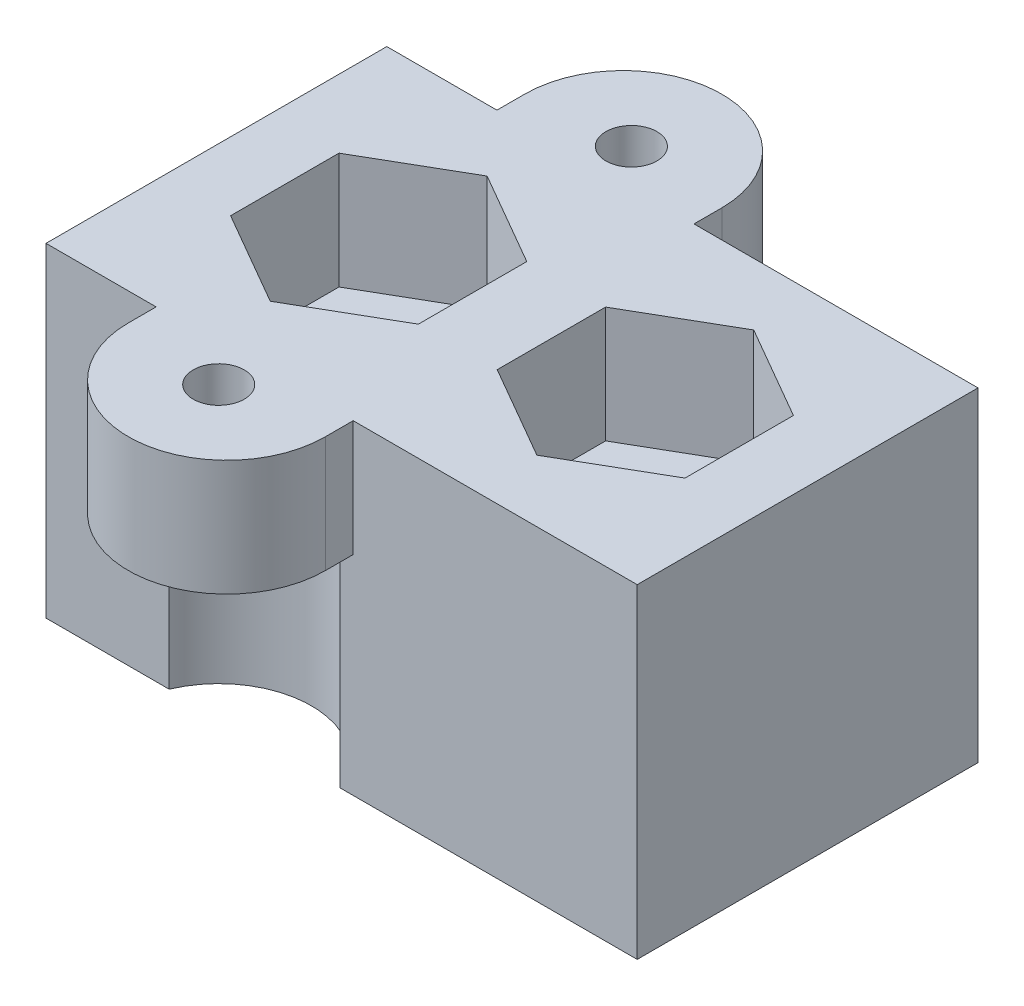
ISO-10303-21;
HEADER;
FILE_DESCRIPTION(('STEP AP214'),'2;1');
FILE_NAME('part.step','',(''),(''),'','','');
FILE_SCHEMA(('AUTOMOTIVE_DESIGN { 1 0 10303 214 1 1 1 1 }'));
ENDSEC;
DATA;
#1=APPLICATION_CONTEXT('core data for automotive mechanical design processes');
#2=APPLICATION_PROTOCOL_DEFINITION('international standard','automotive_design',2000,#1);
#3=PRODUCT_CONTEXT('',#1,'mechanical');
#4=PRODUCT('Part','Part','',(#3));
#5=PRODUCT_RELATED_PRODUCT_CATEGORY('part','',(#4));
#6=PRODUCT_DEFINITION_FORMATION('','',#4);
#7=PRODUCT_DEFINITION_CONTEXT('part definition',#1,'design');
#8=PRODUCT_DEFINITION('design','',#6,#7);
#9=PRODUCT_DEFINITION_SHAPE('','',#8);
#10=(LENGTH_UNIT() NAMED_UNIT(*) SI_UNIT(.MILLI.,.METRE.));
#11=(NAMED_UNIT(*) PLANE_ANGLE_UNIT() SI_UNIT($,.RADIAN.));
#12=(NAMED_UNIT(*) SI_UNIT($,.STERADIAN.) SOLID_ANGLE_UNIT());
#13=UNCERTAINTY_MEASURE_WITH_UNIT(LENGTH_MEASURE(1.E-05),#10,'distance_accuracy_value','');
#14=(GEOMETRIC_REPRESENTATION_CONTEXT(3) GLOBAL_UNCERTAINTY_ASSIGNED_CONTEXT((#13)) GLOBAL_UNIT_ASSIGNED_CONTEXT((#10,
#11,#12)) REPRESENTATION_CONTEXT('',''));
#15=CARTESIAN_POINT('',(0.,0.,0.));
#16=DIRECTION('',(0.,0.,1.));
#17=DIRECTION('',(1.,0.,0.));
#18=AXIS2_PLACEMENT_3D('',#15,#16,#17);
#19=CARTESIAN_POINT('',(11.0405831282105,0.,0.));
#20=DIRECTION('',(0.,-1.,0.));
#21=DIRECTION('',(0.,0.,-1.));
#22=AXIS2_PLACEMENT_3D('',#19,#20,#21);
#23=CYLINDRICAL_SURFACE('',#22,2.65);
#24=CARTESIAN_POINT('',(11.0405831282105,0.,0.));
#25=DIRECTION('',(0.,-1.,0.));
#26=DIRECTION('',(0.,0.,-1.));
#27=AXIS2_PLACEMENT_3D('',#24,#25,#26);
#28=CIRCLE('',#27,2.65);
#29=CARTESIAN_POINT('',(11.0405831282105,0.,-2.65));
#30=VERTEX_POINT('',#29);
#31=EDGE_CURVE('E327',#30,#30,#28,.T.);
#32=ORIENTED_EDGE('',*,*,#31,.T.);
#33=EDGE_LOOP('',(#32));
#34=FACE_BOUND('',#33,.T.);
#35=CARTESIAN_POINT('',(11.0405831282105,9.,0.));
#36=DIRECTION('',(0.,1.,0.));
#37=DIRECTION('',(0.,0.,1.));
#38=AXIS2_PLACEMENT_3D('',#35,#36,#37);
#39=CIRCLE('',#38,2.65);
#40=CARTESIAN_POINT('',(11.0405831282105,9.,2.65));
#41=VERTEX_POINT('',#40);
#42=EDGE_CURVE('E40',#41,#41,#39,.F.);
#43=ORIENTED_EDGE('',*,*,#42,.F.);
#44=EDGE_LOOP('',(#43));
#45=FACE_BOUND('',#44,.T.);
#46=ADVANCED_FACE('F35',(#34,#45),#23,.F.);
#47=CARTESIAN_POINT('',(22.5405831282105,0.,0.));
#48=DIRECTION('',(0.,-1.,0.));
#49=DIRECTION('',(0.,0.,-1.));
#50=AXIS2_PLACEMENT_3D('',#47,#48,#49);
#51=CYLINDRICAL_SURFACE('',#50,2.65);
#52=CARTESIAN_POINT('',(22.5405831282105,0.,0.));
#53=DIRECTION('',(0.,-1.,0.));
#54=DIRECTION('',(0.,0.,-1.));
#55=AXIS2_PLACEMENT_3D('',#52,#53,#54);
#56=CIRCLE('',#55,2.65);
#57=CARTESIAN_POINT('',(22.5405831282105,0.,-2.65));
#58=VERTEX_POINT('',#57);
#59=EDGE_CURVE('E324',#58,#58,#56,.T.);
#60=ORIENTED_EDGE('',*,*,#59,.T.);
#61=EDGE_LOOP('',(#60));
#62=FACE_BOUND('',#61,.T.);
#63=CARTESIAN_POINT('',(22.5405831282105,9.,0.));
#64=DIRECTION('',(0.,1.,0.));
#65=DIRECTION('',(0.,0.,1.));
#66=AXIS2_PLACEMENT_3D('',#63,#64,#65);
#67=CIRCLE('',#66,2.65);
#68=CARTESIAN_POINT('',(22.5405831282105,9.,2.65));
#69=VERTEX_POINT('',#68);
#70=EDGE_CURVE('E271',#69,#69,#67,.F.);
#71=ORIENTED_EDGE('',*,*,#70,.F.);
#72=EDGE_LOOP('',(#71));
#73=FACE_BOUND('',#72,.T.);
#74=ADVANCED_FACE('F462',(#62,#73),#51,.F.);
#75=CARTESIAN_POINT('',(4.04058312821053,14.,7.35));
#76=DIRECTION('',(0.,0.,-1.));
#77=DIRECTION('',(-1.,0.,0.));
#78=AXIS2_PLACEMENT_3D('',#75,#76,#77);
#79=PLANE('',#78);
#80=DIRECTION('',(0.,-1.,0.));
#81=VECTOR('',#80,1.);
#82=CARTESIAN_POINT('',(16.728061941709,20.3137084989848,7.35));
#83=LINE('',#82,#81);
#84=CARTESIAN_POINT('',(16.728061941709,0.,7.35));
#85=VERTEX_POINT('',#84);
#86=CARTESIAN_POINT('',(16.728061941709,9.,7.35));
#87=VERTEX_POINT('',#86);
#88=EDGE_CURVE('E338',#85,#87,#83,.F.);
#89=ORIENTED_EDGE('',*,*,#88,.F.);
#90=DIRECTION('',(1.,0.,0.));
#91=VECTOR('',#90,1.);
#92=CARTESIAN_POINT('',(4.04058312821053,0.,7.35));
#93=LINE('',#92,#91);
#94=CARTESIAN_POINT('',(29.5405831282105,0.,7.35));
#95=VERTEX_POINT('',#94);
#96=EDGE_CURVE('E419',#85,#95,#93,.T.);
#97=ORIENTED_EDGE('',*,*,#96,.T.);
#98=DIRECTION('',(0.,-1.,0.));
#99=VECTOR('',#98,1.);
#100=CARTESIAN_POINT('',(29.5405831282105,14.,7.35));
#101=LINE('',#100,#99);
#102=CARTESIAN_POINT('',(29.5405831282105,14.,7.35));
#103=VERTEX_POINT('',#102);
#104=EDGE_CURVE('E433',#103,#95,#101,.T.);
#105=ORIENTED_EDGE('',*,*,#104,.F.);
#106=DIRECTION('',(1.,0.,0.));
#107=VECTOR('',#106,1.);
#108=CARTESIAN_POINT('',(4.04058312821053,14.,7.35));
#109=LINE('',#108,#107);
#110=CARTESIAN_POINT('',(17.2905831282105,14.,7.35));
#111=VERTEX_POINT('',#110);
#112=EDGE_CURVE('E405',#111,#103,#109,.T.);
#113=ORIENTED_EDGE('',*,*,#112,.F.);
#114=DIRECTION('',(0.,1.,0.));
#115=VECTOR('',#114,1.);
#116=CARTESIAN_POINT('',(17.2905831282105,9.,7.35));
#117=LINE('',#116,#115);
#118=CARTESIAN_POINT('',(17.2905831282105,9.,7.35));
#119=VERTEX_POINT('',#118);
#120=EDGE_CURVE('E357',#119,#111,#117,.T.);
#121=ORIENTED_EDGE('',*,*,#120,.F.);
#122=DIRECTION('',(-1.,0.,0.));
#123=VECTOR('',#122,1.);
#124=CARTESIAN_POINT('',(8.79058312821052,9.,7.35));
#125=LINE('',#124,#123);
#126=EDGE_CURVE('E352',#119,#87,#125,.T.);
#127=ORIENTED_EDGE('',*,*,#126,.T.);
#128=EDGE_LOOP('',(#89,#97,#105,#113,#121,#127));
#129=FACE_BOUND('',#128,.T.);
#130=ADVANCED_FACE('F468',(#129),#79,.F.);
#131=DIRECTION('',(0.,-1.,0.));
#132=VECTOR('',#131,1.);
#133=CARTESIAN_POINT('',(9.35310431471207,20.3137084989848,7.35));
#134=LINE('',#133,#132);
#135=CARTESIAN_POINT('',(9.35310431471207,9.,7.35));
#136=VERTEX_POINT('',#135);
#137=CARTESIAN_POINT('',(9.35310431471207,0.,7.35));
#138=VERTEX_POINT('',#137);
#139=EDGE_CURVE('E336',#136,#138,#134,.T.);
#140=ORIENTED_EDGE('',*,*,#139,.F.);
#141=CARTESIAN_POINT('',(8.79058312821052,9.,7.35));
#142=VERTEX_POINT('',#141);
#143=EDGE_CURVE('E350',#136,#142,#125,.T.);
#144=ORIENTED_EDGE('',*,*,#143,.T.);
#145=DIRECTION('',(0.,1.,0.));
#146=VECTOR('',#145,1.);
#147=CARTESIAN_POINT('',(8.79058312821052,9.,7.35));
#148=LINE('',#147,#146);
#149=CARTESIAN_POINT('',(8.79058312821052,14.,7.35));
#150=VERTEX_POINT('',#149);
#151=EDGE_CURVE('E363',#142,#150,#148,.T.);
#152=ORIENTED_EDGE('',*,*,#151,.T.);
#153=CARTESIAN_POINT('',(4.04058312821053,14.,7.35));
#154=VERTEX_POINT('',#153);
#155=EDGE_CURVE('E407',#154,#150,#109,.T.);
#156=ORIENTED_EDGE('',*,*,#155,.F.);
#157=DIRECTION('',(0.,-1.,0.));
#158=VECTOR('',#157,1.);
#159=CARTESIAN_POINT('',(4.04058312821053,14.,7.35));
#160=LINE('',#159,#158);
#161=CARTESIAN_POINT('',(4.04058312821053,0.,7.35));
#162=VERTEX_POINT('',#161);
#163=EDGE_CURVE('E436',#154,#162,#160,.T.);
#164=ORIENTED_EDGE('',*,*,#163,.T.);
#165=EDGE_CURVE('E420',#162,#138,#93,.T.);
#166=ORIENTED_EDGE('',*,*,#165,.T.);
#167=EDGE_LOOP('',(#140,#144,#152,#156,#164,#166));
#168=FACE_BOUND('',#167,.T.);
#169=ADVANCED_FACE('F535',(#168),#79,.F.);
#170=CARTESIAN_POINT('',(13.0405831282105,9.,8.55));
#171=DIRECTION('',(0.,1.,0.));
#172=DIRECTION('',(0.,0.,1.));
#173=AXIS2_PLACEMENT_3D('',#170,#171,#172);
#174=CYLINDRICAL_SURFACE('',#173,4.25);
#175=DIRECTION('',(0.,1.,0.));
#176=VECTOR('',#175,1.);
#177=CARTESIAN_POINT('',(8.79058312821052,9.,8.55));
#178=LINE('',#177,#176);
#179=CARTESIAN_POINT('',(8.79058312821052,9.,8.55));
#180=VERTEX_POINT('',#179);
#181=CARTESIAN_POINT('',(8.79058312821052,14.,8.55));
#182=VERTEX_POINT('',#181);
#183=EDGE_CURVE('E449',#180,#182,#178,.T.);
#184=ORIENTED_EDGE('',*,*,#183,.F.);
#185=CARTESIAN_POINT('',(13.0405831282105,9.,8.55));
#186=DIRECTION('',(0.,-1.,0.));
#187=DIRECTION('',(0.,0.,-1.));
#188=AXIS2_PLACEMENT_3D('',#185,#186,#187);
#189=CIRCLE('',#188,4.25);
#190=CARTESIAN_POINT('',(17.2905831282105,9.,8.55));
#191=VERTEX_POINT('',#190);
#192=EDGE_CURVE('E45',#191,#180,#189,.T.);
#193=ORIENTED_EDGE('',*,*,#192,.F.);
#194=DIRECTION('',(0.,1.,0.));
#195=VECTOR('',#194,1.);
#196=CARTESIAN_POINT('',(17.2905831282105,9.,8.55));
#197=LINE('',#196,#195);
#198=CARTESIAN_POINT('',(17.2905831282105,14.,8.55));
#199=VERTEX_POINT('',#198);
#200=EDGE_CURVE('E452',#199,#191,#197,.F.);
#201=ORIENTED_EDGE('',*,*,#200,.F.);
#202=CARTESIAN_POINT('',(13.0405831282105,14.,8.55));
#203=DIRECTION('',(0.,-1.,0.));
#204=DIRECTION('',(0.,0.,-1.));
#205=AXIS2_PLACEMENT_3D('',#202,#203,#204);
#206=CIRCLE('',#205,4.25);
#207=EDGE_CURVE('E11',#182,#199,#206,.F.);
#208=ORIENTED_EDGE('',*,*,#207,.F.);
#209=EDGE_LOOP('',(#184,#193,#201,#208));
#210=FACE_BOUND('',#209,.T.);
#211=ADVANCED_FACE('F38',(#210),#174,.T.);
#212=CARTESIAN_POINT('',(4.04058312821053,14.,-7.35));
#213=DIRECTION('',(0.,0.,1.));
#214=DIRECTION('',(1.,0.,0.));
#215=AXIS2_PLACEMENT_3D('',#212,#213,#214);
#216=PLANE('',#215);
#217=DIRECTION('',(-1.,0.,0.));
#218=VECTOR('',#217,1.);
#219=CARTESIAN_POINT('',(8.79058312821052,9.,-7.35));
#220=LINE('',#219,#218);
#221=CARTESIAN_POINT('',(9.35310431471207,9.,-7.35));
#222=VERTEX_POINT('',#221);
#223=CARTESIAN_POINT('',(8.79058312821052,9.,-7.35));
#224=VERTEX_POINT('',#223);
#225=EDGE_CURVE('E389',#222,#224,#220,.T.);
#226=ORIENTED_EDGE('',*,*,#225,.F.);
#227=DIRECTION('',(0.,-1.,0.));
#228=VECTOR('',#227,1.);
#229=CARTESIAN_POINT('',(9.35310431471207,20.3137084989848,-7.35));
#230=LINE('',#229,#228);
#231=CARTESIAN_POINT('',(9.35310431471207,0.,-7.35));
#232=VERTEX_POINT('',#231);
#233=EDGE_CURVE('E373',#222,#232,#230,.T.);
#234=ORIENTED_EDGE('',*,*,#233,.T.);
#235=DIRECTION('',(-1.,0.,0.));
#236=VECTOR('',#235,1.);
#237=CARTESIAN_POINT('',(4.04058312821053,0.,-7.35));
#238=LINE('',#237,#236);
#239=CARTESIAN_POINT('',(4.04058312821053,0.,-7.35));
#240=VERTEX_POINT('',#239);
#241=EDGE_CURVE('E425',#232,#240,#238,.T.);
#242=ORIENTED_EDGE('',*,*,#241,.T.);
#243=DIRECTION('',(0.,-1.,0.));
#244=VECTOR('',#243,1.);
#245=CARTESIAN_POINT('',(4.04058312821053,14.,-7.35));
#246=LINE('',#245,#244);
#247=CARTESIAN_POINT('',(4.04058312821053,14.,-7.35));
#248=VERTEX_POINT('',#247);
#249=EDGE_CURVE('E416',#248,#240,#246,.T.);
#250=ORIENTED_EDGE('',*,*,#249,.F.);
#251=DIRECTION('',(-1.,0.,0.));
#252=VECTOR('',#251,1.);
#253=CARTESIAN_POINT('',(4.04058312821053,14.,-7.35));
#254=LINE('',#253,#252);
#255=CARTESIAN_POINT('',(8.79058312821052,14.,-7.35));
#256=VERTEX_POINT('',#255);
#257=EDGE_CURVE('E412',#256,#248,#254,.T.);
#258=ORIENTED_EDGE('',*,*,#257,.F.);
#259=DIRECTION('',(0.,1.,0.));
#260=VECTOR('',#259,1.);
#261=CARTESIAN_POINT('',(8.79058312821052,9.,-7.35));
#262=LINE('',#261,#260);
#263=EDGE_CURVE('E393',#224,#256,#262,.T.);
#264=ORIENTED_EDGE('',*,*,#263,.F.);
#265=EDGE_LOOP('',(#226,#234,#242,#250,#258,#264));
#266=FACE_BOUND('',#265,.T.);
#267=ADVANCED_FACE('F529',(#266),#216,.F.);
#268=CARTESIAN_POINT('',(13.0405831282105,14.,-8.55));
#269=DIRECTION('',(0.,1.,0.));
#270=DIRECTION('',(0.,0.,1.));
#271=AXIS2_PLACEMENT_3D('',#268,#269,#270);
#272=CYLINDRICAL_SURFACE('',#271,4.25);
#273=DIRECTION('',(0.,1.,0.));
#274=VECTOR('',#273,1.);
#275=CARTESIAN_POINT('',(8.79058312821052,9.,-8.55));
#276=LINE('',#275,#274);
#277=CARTESIAN_POINT('',(8.79058312821052,14.,-8.55));
#278=VERTEX_POINT('',#277);
#279=CARTESIAN_POINT('',(8.79058312821052,9.,-8.55));
#280=VERTEX_POINT('',#279);
#281=EDGE_CURVE('E439',#278,#280,#276,.F.);
#282=ORIENTED_EDGE('',*,*,#281,.F.);
#283=CARTESIAN_POINT('',(13.0405831282105,14.,-8.55));
#284=DIRECTION('',(0.,-1.,0.));
#285=DIRECTION('',(0.,0.,-1.));
#286=AXIS2_PLACEMENT_3D('',#283,#284,#285);
#287=CIRCLE('',#286,4.25);
#288=CARTESIAN_POINT('',(17.2905831282105,14.,-8.55));
#289=VERTEX_POINT('',#288);
#290=EDGE_CURVE('E445',#289,#278,#287,.F.);
#291=ORIENTED_EDGE('',*,*,#290,.F.);
#292=DIRECTION('',(0.,1.,0.));
#293=VECTOR('',#292,1.);
#294=CARTESIAN_POINT('',(17.2905831282105,9.,-8.55));
#295=LINE('',#294,#293);
#296=CARTESIAN_POINT('',(17.2905831282105,9.,-8.55));
#297=VERTEX_POINT('',#296);
#298=EDGE_CURVE('E442',#297,#289,#295,.T.);
#299=ORIENTED_EDGE('',*,*,#298,.F.);
#300=CARTESIAN_POINT('',(13.0405831282105,9.,-8.55));
#301=DIRECTION('',(0.,-1.,0.));
#302=DIRECTION('',(0.,0.,-1.));
#303=AXIS2_PLACEMENT_3D('',#300,#301,#302);
#304=CIRCLE('',#303,4.25);
#305=EDGE_CURVE('E447',#280,#297,#304,.T.);
#306=ORIENTED_EDGE('',*,*,#305,.F.);
#307=EDGE_LOOP('',(#282,#291,#299,#306));
#308=FACE_BOUND('',#307,.T.);
#309=ADVANCED_FACE('F527',(#308),#272,.T.);
#310=CARTESIAN_POINT('',(29.5405831282105,0.,-7.35));
#311=VERTEX_POINT('',#310);
#312=CARTESIAN_POINT('',(16.728061941709,0.,-7.35));
#313=VERTEX_POINT('',#312);
#314=EDGE_CURVE('E406',#311,#313,#238,.T.);
#315=ORIENTED_EDGE('',*,*,#314,.T.);
#316=DIRECTION('',(0.,-1.,0.));
#317=VECTOR('',#316,1.);
#318=CARTESIAN_POINT('',(16.728061941709,20.3137084989848,-7.35));
#319=LINE('',#318,#317);
#320=CARTESIAN_POINT('',(16.728061941709,9.,-7.35));
#321=VERTEX_POINT('',#320);
#322=EDGE_CURVE('E370',#313,#321,#319,.F.);
#323=ORIENTED_EDGE('',*,*,#322,.T.);
#324=CARTESIAN_POINT('',(17.2905831282105,9.,-7.35));
#325=VERTEX_POINT('',#324);
#326=EDGE_CURVE('E390',#325,#321,#220,.T.);
#327=ORIENTED_EDGE('',*,*,#326,.F.);
#328=DIRECTION('',(0.,1.,0.));
#329=VECTOR('',#328,1.);
#330=CARTESIAN_POINT('',(17.2905831282105,9.,-7.35));
#331=LINE('',#330,#329);
#332=CARTESIAN_POINT('',(17.2905831282105,14.,-7.35));
#333=VERTEX_POINT('',#332);
#334=EDGE_CURVE('E398',#325,#333,#331,.T.);
#335=ORIENTED_EDGE('',*,*,#334,.T.);
#336=CARTESIAN_POINT('',(29.5405831282105,14.,-7.35));
#337=VERTEX_POINT('',#336);
#338=EDGE_CURVE('E413',#337,#333,#254,.T.);
#339=ORIENTED_EDGE('',*,*,#338,.F.);
#340=DIRECTION('',(0.,-1.,0.));
#341=VECTOR('',#340,1.);
#342=CARTESIAN_POINT('',(29.5405831282105,14.,-7.35));
#343=LINE('',#342,#341);
#344=EDGE_CURVE('E430',#337,#311,#343,.T.);
#345=ORIENTED_EDGE('',*,*,#344,.T.);
#346=EDGE_LOOP('',(#315,#323,#327,#335,#339,#345));
#347=FACE_BOUND('',#346,.T.);
#348=ADVANCED_FACE('F523',(#347),#216,.F.);
#349=CARTESIAN_POINT('',(4.04058312821053,14.,7.35));
#350=DIRECTION('',(1.,0.,0.));
#351=DIRECTION('',(0.,0.,-1.));
#352=AXIS2_PLACEMENT_3D('',#349,#350,#351);
#353=PLANE('',#352);
#354=DIRECTION('',(0.,0.,1.));
#355=VECTOR('',#354,1.);
#356=CARTESIAN_POINT('',(4.04058312821053,0.,7.35));
#357=LINE('',#356,#355);
#358=EDGE_CURVE('E401',#240,#162,#357,.T.);
#359=ORIENTED_EDGE('',*,*,#358,.T.);
#360=ORIENTED_EDGE('',*,*,#163,.F.);
#361=DIRECTION('',(0.,0.,1.));
#362=VECTOR('',#361,1.);
#363=CARTESIAN_POINT('',(4.04058312821053,14.,7.35));
#364=LINE('',#363,#362);
#365=EDGE_CURVE('E402',#248,#154,#364,.T.);
#366=ORIENTED_EDGE('',*,*,#365,.F.);
#367=ORIENTED_EDGE('',*,*,#249,.T.);
#368=EDGE_LOOP('',(#359,#360,#366,#367));
#369=FACE_BOUND('',#368,.T.);
#370=ADVANCED_FACE('F526',(#369),#353,.F.);
#371=CARTESIAN_POINT('',(29.5405831282105,14.,7.35));
#372=DIRECTION('',(-1.,0.,0.));
#373=DIRECTION('',(0.,0.,1.));
#374=AXIS2_PLACEMENT_3D('',#371,#372,#373);
#375=PLANE('',#374);
#376=DIRECTION('',(0.,0.,-1.));
#377=VECTOR('',#376,1.);
#378=CARTESIAN_POINT('',(29.5405831282105,0.,7.35));
#379=LINE('',#378,#377);
#380=EDGE_CURVE('E423',#95,#311,#379,.T.);
#381=ORIENTED_EDGE('',*,*,#380,.T.);
#382=ORIENTED_EDGE('',*,*,#344,.F.);
#383=DIRECTION('',(0.,0.,-1.));
#384=VECTOR('',#383,1.);
#385=CARTESIAN_POINT('',(29.5405831282105,14.,7.35));
#386=LINE('',#385,#384);
#387=EDGE_CURVE('E410',#103,#337,#386,.T.);
#388=ORIENTED_EDGE('',*,*,#387,.F.);
#389=ORIENTED_EDGE('',*,*,#104,.T.);
#390=EDGE_LOOP('',(#381,#382,#388,#389));
#391=FACE_BOUND('',#390,.T.);
#392=ADVANCED_FACE('F518',(#391),#375,.F.);
#393=CARTESIAN_POINT('',(0.,14.,0.));
#394=DIRECTION('',(0.,-1.,0.));
#395=DIRECTION('',(0.,0.,-1.));
#396=AXIS2_PLACEMENT_3D('',#393,#394,#395);
#397=PLANE('',#396);
#398=DIRECTION('',(-0.866025403784439,0.,0.5));
#399=VECTOR('',#398,1.);
#400=CARTESIAN_POINT('',(11.0405831282105,14.,-4.67653718043597));
#401=LINE('',#400,#399);
#402=CARTESIAN_POINT('',(11.0405831282105,14.,-4.67653718043597));
#403=VERTEX_POINT('',#402);
#404=CARTESIAN_POINT('',(6.99058312821053,14.,-2.33826859021798));
#405=VERTEX_POINT('',#404);
#406=EDGE_CURVE('E258',#403,#405,#401,.T.);
#407=ORIENTED_EDGE('',*,*,#406,.F.);
#408=DIRECTION('',(-0.866025403784439,0.,-0.5));
#409=VECTOR('',#408,1.);
#410=CARTESIAN_POINT('',(15.0905831282105,14.,-2.33826859021799));
#411=LINE('',#410,#409);
#412=CARTESIAN_POINT('',(15.0905831282105,14.,-2.33826859021799));
#413=VERTEX_POINT('',#412);
#414=EDGE_CURVE('E53',#413,#403,#411,.T.);
#415=ORIENTED_EDGE('',*,*,#414,.F.);
#416=DIRECTION('',(0.,0.,-1.));
#417=VECTOR('',#416,1.);
#418=CARTESIAN_POINT('',(15.0905831282105,14.,2.33826859021798));
#419=LINE('',#418,#417);
#420=CARTESIAN_POINT('',(15.0905831282105,14.,2.33826859021798));
#421=VERTEX_POINT('',#420);
#422=EDGE_CURVE('E244',#421,#413,#419,.T.);
#423=ORIENTED_EDGE('',*,*,#422,.F.);
#424=DIRECTION('',(0.866025403784439,0.,-0.5));
#425=VECTOR('',#424,1.);
#426=CARTESIAN_POINT('',(11.0405831282105,14.,4.67653718043597));
#427=LINE('',#426,#425);
#428=CARTESIAN_POINT('',(11.0405831282105,14.,4.67653718043597));
#429=VERTEX_POINT('',#428);
#430=EDGE_CURVE('E247',#429,#421,#427,.T.);
#431=ORIENTED_EDGE('',*,*,#430,.F.);
#432=DIRECTION('',(0.866025403784439,0.,0.5));
#433=VECTOR('',#432,1.);
#434=CARTESIAN_POINT('',(6.99058312821053,14.,2.33826859021798));
#435=LINE('',#434,#433);
#436=CARTESIAN_POINT('',(6.99058312821053,14.,2.33826859021798));
#437=VERTEX_POINT('',#436);
#438=EDGE_CURVE('E264',#437,#429,#435,.T.);
#439=ORIENTED_EDGE('',*,*,#438,.F.);
#440=DIRECTION('',(0.,0.,1.));
#441=VECTOR('',#440,1.);
#442=CARTESIAN_POINT('',(6.99058312821053,14.,-2.33826859021798));
#443=LINE('',#442,#441);
#444=EDGE_CURVE('E261',#405,#437,#443,.T.);
#445=ORIENTED_EDGE('',*,*,#444,.F.);
#446=EDGE_LOOP('',(#407,#415,#423,#431,#439,#445));
#447=FACE_BOUND('',#446,.T.);
#448=DIRECTION('',(-0.866025403784439,0.,0.5));
#449=VECTOR('',#448,1.);
#450=CARTESIAN_POINT('',(22.5405831282105,14.,-4.67653718043597));
#451=LINE('',#450,#449);
#452=CARTESIAN_POINT('',(22.5405831282105,14.,-4.67653718043597));
#453=VERTEX_POINT('',#452);
#454=CARTESIAN_POINT('',(18.4905831282105,14.,-2.33826859021798));
#455=VERTEX_POINT('',#454);
#456=EDGE_CURVE('E300',#453,#455,#451,.T.);
#457=ORIENTED_EDGE('',*,*,#456,.F.);
#458=DIRECTION('',(-0.866025403784439,0.,-0.5));
#459=VECTOR('',#458,1.);
#460=CARTESIAN_POINT('',(26.5905831282105,14.,-2.33826859021799));
#461=LINE('',#460,#459);
#462=CARTESIAN_POINT('',(26.5905831282105,14.,-2.33826859021799));
#463=VERTEX_POINT('',#462);
#464=EDGE_CURVE('E61',#463,#453,#461,.T.);
#465=ORIENTED_EDGE('',*,*,#464,.F.);
#466=DIRECTION('',(0.,0.,-1.));
#467=VECTOR('',#466,1.);
#468=CARTESIAN_POINT('',(26.5905831282105,14.,2.33826859021798));
#469=LINE('',#468,#467);
#470=CARTESIAN_POINT('',(26.5905831282105,14.,2.33826859021798));
#471=VERTEX_POINT('',#470);
#472=EDGE_CURVE('E283',#471,#463,#469,.T.);
#473=ORIENTED_EDGE('',*,*,#472,.F.);
#474=DIRECTION('',(0.866025403784439,0.,-0.5));
#475=VECTOR('',#474,1.);
#476=CARTESIAN_POINT('',(22.5405831282105,14.,4.67653718043596));
#477=LINE('',#476,#475);
#478=CARTESIAN_POINT('',(22.5405831282105,14.,4.67653718043596));
#479=VERTEX_POINT('',#478);
#480=EDGE_CURVE('E309',#479,#471,#477,.T.);
#481=ORIENTED_EDGE('',*,*,#480,.F.);
#482=DIRECTION('',(0.866025403784439,0.,0.5));
#483=VECTOR('',#482,1.);
#484=CARTESIAN_POINT('',(18.4905831282105,14.,2.33826859021798));
#485=LINE('',#484,#483);
#486=CARTESIAN_POINT('',(18.4905831282105,14.,2.33826859021798));
#487=VERTEX_POINT('',#486);
#488=EDGE_CURVE('E306',#487,#479,#485,.T.);
#489=ORIENTED_EDGE('',*,*,#488,.F.);
#490=DIRECTION('',(0.,0.,1.));
#491=VECTOR('',#490,1.);
#492=CARTESIAN_POINT('',(18.4905831282105,14.,-2.33826859021798));
#493=LINE('',#492,#491);
#494=EDGE_CURVE('E303',#455,#487,#493,.T.);
#495=ORIENTED_EDGE('',*,*,#494,.F.);
#496=EDGE_LOOP('',(#457,#465,#473,#481,#489,#495));
#497=FACE_BOUND('',#496,.T.);
#498=CARTESIAN_POINT('',(13.0405831282105,14.,8.9));
#499=DIRECTION('',(0.,-1.,0.));
#500=DIRECTION('',(0.,0.,-1.));
#501=AXIS2_PLACEMENT_3D('',#498,#499,#500);
#502=CIRCLE('',#501,1.1);
#503=CARTESIAN_POINT('',(13.0405831282105,14.,7.8));
#504=VERTEX_POINT('',#503);
#505=EDGE_CURVE('E343',#504,#504,#502,.T.);
#506=ORIENTED_EDGE('',*,*,#505,.T.);
#507=EDGE_LOOP('',(#506));
#508=FACE_BOUND('',#507,.T.);
#509=CARTESIAN_POINT('',(13.0405831282105,14.,-8.9));
#510=DIRECTION('',(0.,-1.,0.));
#511=DIRECTION('',(0.,0.,-1.));
#512=AXIS2_PLACEMENT_3D('',#509,#510,#511);
#513=CIRCLE('',#512,1.1);
#514=CARTESIAN_POINT('',(13.0405831282105,14.,-10.));
#515=VERTEX_POINT('',#514);
#516=EDGE_CURVE('E379',#515,#515,#513,.T.);
#517=ORIENTED_EDGE('',*,*,#516,.T.);
#518=EDGE_LOOP('',(#517));
#519=FACE_BOUND('',#518,.T.);
#520=DIRECTION('',(0.,0.,1.));
#521=VECTOR('',#520,1.);
#522=CARTESIAN_POINT('',(8.79058312821052,14.,7.35));
#523=LINE('',#522,#521);
#524=EDGE_CURVE('E346',#150,#182,#523,.T.);
#525=ORIENTED_EDGE('',*,*,#524,.T.);
#526=ORIENTED_EDGE('',*,*,#207,.T.);
#527=DIRECTION('',(0.,0.,-1.));
#528=VECTOR('',#527,1.);
#529=CARTESIAN_POINT('',(17.2905831282105,14.,7.35));
#530=LINE('',#529,#528);
#531=EDGE_CURVE('E351',#199,#111,#530,.T.);
#532=ORIENTED_EDGE('',*,*,#531,.T.);
#533=ORIENTED_EDGE('',*,*,#112,.T.);
#534=ORIENTED_EDGE('',*,*,#387,.T.);
#535=ORIENTED_EDGE('',*,*,#338,.T.);
#536=DIRECTION('',(0.,0.,1.));
#537=VECTOR('',#536,1.);
#538=CARTESIAN_POINT('',(17.2905831282105,14.,-7.35));
#539=LINE('',#538,#537);
#540=EDGE_CURVE('E387',#289,#333,#539,.T.);
#541=ORIENTED_EDGE('',*,*,#540,.F.);
#542=ORIENTED_EDGE('',*,*,#290,.T.);
#543=DIRECTION('',(0.,0.,-1.));
#544=VECTOR('',#543,1.);
#545=CARTESIAN_POINT('',(8.79058312821052,14.,-7.35));
#546=LINE('',#545,#544);
#547=EDGE_CURVE('E382',#256,#278,#546,.T.);
#548=ORIENTED_EDGE('',*,*,#547,.F.);
#549=ORIENTED_EDGE('',*,*,#257,.T.);
#550=ORIENTED_EDGE('',*,*,#365,.T.);
#551=ORIENTED_EDGE('',*,*,#155,.T.);
#552=EDGE_LOOP('',(#525,#526,#532,#533,#534,#535,#541,#542,#548,#549,#550,#551));
#553=FACE_BOUND('',#552,.T.);
#554=ADVANCED_FACE('F515',(#447,#497,#508,#519,#553),#397,.F.);
#555=CARTESIAN_POINT('',(0.,0.,0.));
#556=DIRECTION('',(0.,-1.,0.));
#557=DIRECTION('',(0.,0.,-1.));
#558=AXIS2_PLACEMENT_3D('',#555,#556,#557);
#559=PLANE('',#558);
#560=ORIENTED_EDGE('',*,*,#59,.F.);
#561=EDGE_LOOP('',(#560));
#562=FACE_BOUND('',#561,.T.);
#563=ORIENTED_EDGE('',*,*,#31,.F.);
#564=EDGE_LOOP('',(#563));
#565=FACE_BOUND('',#564,.T.);
#566=ORIENTED_EDGE('',*,*,#96,.F.);
#567=CARTESIAN_POINT('',(13.0405831282105,0.,8.9));
#568=DIRECTION('',(0.,1.,0.));
#569=DIRECTION('',(0.,0.,1.));
#570=AXIS2_PLACEMENT_3D('',#567,#568,#569);
#571=CIRCLE('',#570,4.);
#572=EDGE_CURVE('E330',#85,#138,#571,.T.);
#573=ORIENTED_EDGE('',*,*,#572,.T.);
#574=ORIENTED_EDGE('',*,*,#165,.F.);
#575=ORIENTED_EDGE('',*,*,#358,.F.);
#576=ORIENTED_EDGE('',*,*,#241,.F.);
#577=CARTESIAN_POINT('',(13.0405831282105,0.,-8.9));
#578=DIRECTION('',(0.,-1.,0.));
#579=DIRECTION('',(0.,0.,-1.));
#580=AXIS2_PLACEMENT_3D('',#577,#578,#579);
#581=CIRCLE('',#580,4.);
#582=EDGE_CURVE('E366',#313,#232,#581,.T.);
#583=ORIENTED_EDGE('',*,*,#582,.F.);
#584=ORIENTED_EDGE('',*,*,#314,.F.);
#585=ORIENTED_EDGE('',*,*,#380,.F.);
#586=EDGE_LOOP('',(#566,#573,#574,#575,#576,#583,#584,#585));
#587=FACE_BOUND('',#586,.T.);
#588=ADVANCED_FACE('F513',(#562,#565,#587),#559,.T.);
#589=CARTESIAN_POINT('',(8.79058312821052,9.,-7.35));
#590=DIRECTION('',(1.,0.,0.));
#591=DIRECTION('',(0.,0.,-1.));
#592=AXIS2_PLACEMENT_3D('',#589,#590,#591);
#593=PLANE('',#592);
#594=ORIENTED_EDGE('',*,*,#547,.T.);
#595=ORIENTED_EDGE('',*,*,#281,.T.);
#596=DIRECTION('',(0.,0.,-1.));
#597=VECTOR('',#596,1.);
#598=CARTESIAN_POINT('',(8.79058312821052,9.,-7.35));
#599=LINE('',#598,#597);
#600=EDGE_CURVE('E383',#224,#280,#599,.T.);
#601=ORIENTED_EDGE('',*,*,#600,.F.);
#602=ORIENTED_EDGE('',*,*,#263,.T.);
#603=EDGE_LOOP('',(#594,#595,#601,#602));
#604=FACE_BOUND('',#603,.T.);
#605=ADVANCED_FACE('F509',(#604),#593,.F.);
#606=CARTESIAN_POINT('',(17.2905831282105,9.,-7.35));
#607=DIRECTION('',(-1.,0.,0.));
#608=DIRECTION('',(0.,0.,1.));
#609=AXIS2_PLACEMENT_3D('',#606,#607,#608);
#610=PLANE('',#609);
#611=DIRECTION('',(0.,0.,1.));
#612=VECTOR('',#611,1.);
#613=CARTESIAN_POINT('',(17.2905831282105,9.,-7.35));
#614=LINE('',#613,#612);
#615=EDGE_CURVE('E386',#297,#325,#614,.T.);
#616=ORIENTED_EDGE('',*,*,#615,.F.);
#617=ORIENTED_EDGE('',*,*,#298,.T.);
#618=ORIENTED_EDGE('',*,*,#540,.T.);
#619=ORIENTED_EDGE('',*,*,#334,.F.);
#620=EDGE_LOOP('',(#616,#617,#618,#619));
#621=FACE_BOUND('',#620,.T.);
#622=ADVANCED_FACE('F505',(#621),#610,.F.);
#623=CARTESIAN_POINT('',(0.,9.,0.));
#624=DIRECTION('',(0.,-1.,0.));
#625=DIRECTION('',(0.,0.,-1.));
#626=AXIS2_PLACEMENT_3D('',#623,#624,#625);
#627=PLANE('',#626);
#628=ORIENTED_EDGE('',*,*,#305,.T.);
#629=ORIENTED_EDGE('',*,*,#615,.T.);
#630=ORIENTED_EDGE('',*,*,#326,.T.);
#631=CARTESIAN_POINT('',(13.0405831282105,9.,-8.9));
#632=DIRECTION('',(0.,-1.,0.));
#633=DIRECTION('',(0.,0.,-1.));
#634=AXIS2_PLACEMENT_3D('',#631,#632,#633);
#635=CIRCLE('',#634,4.);
#636=EDGE_CURVE('E368',#222,#321,#635,.F.);
#637=ORIENTED_EDGE('',*,*,#636,.F.);
#638=ORIENTED_EDGE('',*,*,#225,.T.);
#639=ORIENTED_EDGE('',*,*,#600,.T.);
#640=EDGE_LOOP('',(#628,#629,#630,#637,#638,#639));
#641=FACE_BOUND('',#640,.T.);
#642=CARTESIAN_POINT('',(13.0405831282105,9.,-8.9));
#643=DIRECTION('',(0.,-1.,0.));
#644=DIRECTION('',(0.,0.,-1.));
#645=AXIS2_PLACEMENT_3D('',#642,#643,#644);
#646=CIRCLE('',#645,1.1);
#647=CARTESIAN_POINT('',(13.0405831282105,9.,-10.));
#648=VERTEX_POINT('',#647);
#649=EDGE_CURVE('E376',#648,#648,#646,.T.);
#650=ORIENTED_EDGE('',*,*,#649,.F.);
#651=EDGE_LOOP('',(#650));
#652=FACE_BOUND('',#651,.T.);
#653=ADVANCED_FACE('F501',(#641,#652),#627,.T.);
#654=CARTESIAN_POINT('',(13.0405831282105,9.,-8.9));
#655=DIRECTION('',(0.,-1.,0.));
#656=DIRECTION('',(0.,0.,-1.));
#657=AXIS2_PLACEMENT_3D('',#654,#655,#656);
#658=CYLINDRICAL_SURFACE('',#657,1.1);
#659=ORIENTED_EDGE('',*,*,#516,.F.);
#660=EDGE_LOOP('',(#659));
#661=FACE_BOUND('',#660,.T.);
#662=ORIENTED_EDGE('',*,*,#649,.T.);
#663=EDGE_LOOP('',(#662));
#664=FACE_BOUND('',#663,.T.);
#665=ADVANCED_FACE('F497',(#661,#664),#658,.F.);
#666=CARTESIAN_POINT('',(13.0405831282105,20.3137084989848,-8.9));
#667=DIRECTION('',(0.,-1.,0.));
#668=DIRECTION('',(0.,0.,-1.));
#669=AXIS2_PLACEMENT_3D('',#666,#667,#668);
#670=CYLINDRICAL_SURFACE('',#669,4.);
#671=ORIENTED_EDGE('',*,*,#636,.T.);
#672=ORIENTED_EDGE('',*,*,#322,.F.);
#673=ORIENTED_EDGE('',*,*,#582,.T.);
#674=ORIENTED_EDGE('',*,*,#233,.F.);
#675=EDGE_LOOP('',(#671,#672,#673,#674));
#676=FACE_BOUND('',#675,.T.);
#677=ADVANCED_FACE('F493',(#676),#670,.F.);
#678=CARTESIAN_POINT('',(8.79058312821052,9.,7.35));
#679=DIRECTION('',(-1.,0.,0.));
#680=DIRECTION('',(0.,0.,1.));
#681=AXIS2_PLACEMENT_3D('',#678,#679,#680);
#682=PLANE('',#681);
#683=DIRECTION('',(0.,0.,1.));
#684=VECTOR('',#683,1.);
#685=CARTESIAN_POINT('',(8.79058312821052,9.,7.35));
#686=LINE('',#685,#684);
#687=EDGE_CURVE('E347',#142,#180,#686,.T.);
#688=ORIENTED_EDGE('',*,*,#687,.T.);
#689=ORIENTED_EDGE('',*,*,#183,.T.);
#690=ORIENTED_EDGE('',*,*,#524,.F.);
#691=ORIENTED_EDGE('',*,*,#151,.F.);
#692=EDGE_LOOP('',(#688,#689,#690,#691));
#693=FACE_BOUND('',#692,.T.);
#694=ADVANCED_FACE('F489',(#693),#682,.T.);
#695=CARTESIAN_POINT('',(17.2905831282105,9.,7.35));
#696=DIRECTION('',(1.,0.,0.));
#697=DIRECTION('',(0.,0.,-1.));
#698=AXIS2_PLACEMENT_3D('',#695,#696,#697);
#699=PLANE('',#698);
#700=ORIENTED_EDGE('',*,*,#531,.F.);
#701=ORIENTED_EDGE('',*,*,#200,.T.);
#702=DIRECTION('',(0.,0.,-1.));
#703=VECTOR('',#702,1.);
#704=CARTESIAN_POINT('',(17.2905831282105,9.,7.35));
#705=LINE('',#704,#703);
#706=EDGE_CURVE('E355',#191,#119,#705,.T.);
#707=ORIENTED_EDGE('',*,*,#706,.T.);
#708=ORIENTED_EDGE('',*,*,#120,.T.);
#709=EDGE_LOOP('',(#700,#701,#707,#708));
#710=FACE_BOUND('',#709,.T.);
#711=ADVANCED_FACE('F485',(#710),#699,.T.);
#712=CARTESIAN_POINT('',(0.,9.,0.));
#713=DIRECTION('',(0.,-1.,0.));
#714=DIRECTION('',(0.,0.,1.));
#715=AXIS2_PLACEMENT_3D('',#712,#713,#714);
#716=PLANE('',#715);
#717=ORIENTED_EDGE('',*,*,#192,.T.);
#718=ORIENTED_EDGE('',*,*,#687,.F.);
#719=ORIENTED_EDGE('',*,*,#143,.F.);
#720=CARTESIAN_POINT('',(13.0405831282105,9.,8.9));
#721=DIRECTION('',(0.,-1.,0.));
#722=DIRECTION('',(0.,0.,-1.));
#723=AXIS2_PLACEMENT_3D('',#720,#721,#722);
#724=CIRCLE('',#723,4.);
#725=EDGE_CURVE('E333',#136,#87,#724,.T.);
#726=ORIENTED_EDGE('',*,*,#725,.T.);
#727=ORIENTED_EDGE('',*,*,#126,.F.);
#728=ORIENTED_EDGE('',*,*,#706,.F.);
#729=EDGE_LOOP('',(#717,#718,#719,#726,#727,#728));
#730=FACE_BOUND('',#729,.T.);
#731=CARTESIAN_POINT('',(13.0405831282105,9.,8.9));
#732=DIRECTION('',(0.,-1.,0.));
#733=DIRECTION('',(0.,0.,-1.));
#734=AXIS2_PLACEMENT_3D('',#731,#732,#733);
#735=CIRCLE('',#734,1.1);
#736=CARTESIAN_POINT('',(13.0405831282105,9.,7.8));
#737=VERTEX_POINT('',#736);
#738=EDGE_CURVE('E340',#737,#737,#735,.T.);
#739=ORIENTED_EDGE('',*,*,#738,.F.);
#740=EDGE_LOOP('',(#739));
#741=FACE_BOUND('',#740,.T.);
#742=ADVANCED_FACE('F481',(#730,#741),#716,.T.);
#743=CARTESIAN_POINT('',(13.0405831282105,9.,8.9));
#744=DIRECTION('',(0.,-1.,0.));
#745=DIRECTION('',(0.,0.,-1.));
#746=AXIS2_PLACEMENT_3D('',#743,#744,#745);
#747=CYLINDRICAL_SURFACE('',#746,1.1);
#748=ORIENTED_EDGE('',*,*,#505,.F.);
#749=EDGE_LOOP('',(#748));
#750=FACE_BOUND('',#749,.T.);
#751=ORIENTED_EDGE('',*,*,#738,.T.);
#752=EDGE_LOOP('',(#751));
#753=FACE_BOUND('',#752,.T.);
#754=ADVANCED_FACE('F477',(#750,#753),#747,.F.);
#755=CARTESIAN_POINT('',(13.0405831282105,20.3137084989848,8.9));
#756=DIRECTION('',(0.,-1.,0.));
#757=DIRECTION('',(0.,0.,-1.));
#758=AXIS2_PLACEMENT_3D('',#755,#756,#757);
#759=CYLINDRICAL_SURFACE('',#758,4.);
#760=ORIENTED_EDGE('',*,*,#88,.T.);
#761=ORIENTED_EDGE('',*,*,#725,.F.);
#762=ORIENTED_EDGE('',*,*,#139,.T.);
#763=ORIENTED_EDGE('',*,*,#572,.F.);
#764=EDGE_LOOP('',(#760,#761,#762,#763));
#765=FACE_BOUND('',#764,.T.);
#766=ADVANCED_FACE('F473',(#765),#759,.F.);
#767=CARTESIAN_POINT('',(0.,9.,0.));
#768=DIRECTION('',(0.,1.,0.));
#769=DIRECTION('',(0.,0.,1.));
#770=AXIS2_PLACEMENT_3D('',#767,#768,#769);
#771=PLANE('',#770);
#772=DIRECTION('',(-0.866025403784439,0.,-0.5));
#773=VECTOR('',#772,1.);
#774=CARTESIAN_POINT('',(26.5905831282105,9.,-2.33826859021799));
#775=LINE('',#774,#773);
#776=CARTESIAN_POINT('',(26.5905831282105,9.,-2.33826859021799));
#777=VERTEX_POINT('',#776);
#778=CARTESIAN_POINT('',(22.5405831282105,9.,-4.67653718043597));
#779=VERTEX_POINT('',#778);
#780=EDGE_CURVE('E279',#777,#779,#775,.T.);
#781=ORIENTED_EDGE('',*,*,#780,.T.);
#782=DIRECTION('',(-0.866025403784439,0.,0.5));
#783=VECTOR('',#782,1.);
#784=CARTESIAN_POINT('',(22.5405831282105,9.,-4.67653718043597));
#785=LINE('',#784,#783);
#786=CARTESIAN_POINT('',(18.4905831282105,9.,-2.33826859021798));
#787=VERTEX_POINT('',#786);
#788=EDGE_CURVE('E282',#779,#787,#785,.T.);
#789=ORIENTED_EDGE('',*,*,#788,.T.);
#790=DIRECTION('',(0.,0.,1.));
#791=VECTOR('',#790,1.);
#792=CARTESIAN_POINT('',(18.4905831282105,9.,-2.33826859021798));
#793=LINE('',#792,#791);
#794=CARTESIAN_POINT('',(18.4905831282105,9.,2.33826859021798));
#795=VERTEX_POINT('',#794);
#796=EDGE_CURVE('E286',#787,#795,#793,.T.);
#797=ORIENTED_EDGE('',*,*,#796,.T.);
#798=DIRECTION('',(0.866025403784439,0.,0.5));
#799=VECTOR('',#798,1.);
#800=CARTESIAN_POINT('',(18.4905831282105,9.,2.33826859021798));
#801=LINE('',#800,#799);
#802=CARTESIAN_POINT('',(22.5405831282105,9.,4.67653718043596));
#803=VERTEX_POINT('',#802);
#804=EDGE_CURVE('E289',#795,#803,#801,.T.);
#805=ORIENTED_EDGE('',*,*,#804,.T.);
#806=DIRECTION('',(0.866025403784439,0.,-0.5));
#807=VECTOR('',#806,1.);
#808=CARTESIAN_POINT('',(22.5405831282105,9.,4.67653718043596));
#809=LINE('',#808,#807);
#810=CARTESIAN_POINT('',(26.5905831282105,9.,2.33826859021798));
#811=VERTEX_POINT('',#810);
#812=EDGE_CURVE('E292',#803,#811,#809,.T.);
#813=ORIENTED_EDGE('',*,*,#812,.T.);
#814=DIRECTION('',(0.,0.,-1.));
#815=VECTOR('',#814,1.);
#816=CARTESIAN_POINT('',(26.5905831282105,9.,2.33826859021798));
#817=LINE('',#816,#815);
#818=EDGE_CURVE('E295',#811,#777,#817,.T.);
#819=ORIENTED_EDGE('',*,*,#818,.T.);
#820=EDGE_LOOP('',(#781,#789,#797,#805,#813,#819));
#821=FACE_BOUND('',#820,.T.);
#822=ORIENTED_EDGE('',*,*,#70,.T.);
#823=EDGE_LOOP('',(#822));
#824=FACE_BOUND('',#823,.T.);
#825=ADVANCED_FACE('F476',(#821,#824),#771,.T.);
#826=CARTESIAN_POINT('',(26.5905831282105,9.,-2.33826859021799));
#827=DIRECTION('',(0.5,0.,-0.866025403784439));
#828=DIRECTION('',(-0.866025403784439,0.,-0.5));
#829=AXIS2_PLACEMENT_3D('',#826,#827,#828);
#830=PLANE('',#829);
#831=ORIENTED_EDGE('',*,*,#464,.T.);
#832=DIRECTION('',(0.,1.,0.));
#833=VECTOR('',#832,1.);
#834=CARTESIAN_POINT('',(22.5405831282105,9.,-4.67653718043597));
#835=LINE('',#834,#833);
#836=EDGE_CURVE('E298',#779,#453,#835,.T.);
#837=ORIENTED_EDGE('',*,*,#836,.F.);
#838=ORIENTED_EDGE('',*,*,#780,.F.);
#839=DIRECTION('',(0.,1.,0.));
#840=VECTOR('',#839,1.);
#841=CARTESIAN_POINT('',(26.5905831282105,9.,-2.33826859021799));
#842=LINE('',#841,#840);
#843=EDGE_CURVE('E259',#777,#463,#842,.T.);
#844=ORIENTED_EDGE('',*,*,#843,.T.);
#845=EDGE_LOOP('',(#831,#837,#838,#844));
#846=FACE_BOUND('',#845,.T.);
#847=ADVANCED_FACE('F630',(#846),#830,.F.);
#848=CARTESIAN_POINT('',(26.5905831282105,9.,2.33826859021798));
#849=DIRECTION('',(1.,0.,0.));
#850=DIRECTION('',(0.,0.,-1.));
#851=AXIS2_PLACEMENT_3D('',#848,#849,#850);
#852=PLANE('',#851);
#853=ORIENTED_EDGE('',*,*,#472,.T.);
#854=ORIENTED_EDGE('',*,*,#843,.F.);
#855=ORIENTED_EDGE('',*,*,#818,.F.);
#856=DIRECTION('',(0.,1.,0.));
#857=VECTOR('',#856,1.);
#858=CARTESIAN_POINT('',(26.5905831282105,9.,2.33826859021798));
#859=LINE('',#858,#857);
#860=EDGE_CURVE('E315',#811,#471,#859,.T.);
#861=ORIENTED_EDGE('',*,*,#860,.T.);
#862=EDGE_LOOP('',(#853,#854,#855,#861));
#863=FACE_BOUND('',#862,.T.);
#864=ADVANCED_FACE('F640',(#863),#852,.F.);
#865=CARTESIAN_POINT('',(22.5405831282105,9.,4.67653718043596));
#866=DIRECTION('',(0.5,0.,0.866025403784439));
#867=DIRECTION('',(0.866025403784439,0.,-0.5));
#868=AXIS2_PLACEMENT_3D('',#865,#866,#867);
#869=PLANE('',#868);
#870=ORIENTED_EDGE('',*,*,#480,.T.);
#871=ORIENTED_EDGE('',*,*,#860,.F.);
#872=ORIENTED_EDGE('',*,*,#812,.F.);
#873=DIRECTION('',(0.,1.,0.));
#874=VECTOR('',#873,1.);
#875=CARTESIAN_POINT('',(22.5405831282105,9.,4.67653718043596));
#876=LINE('',#875,#874);
#877=EDGE_CURVE('E317',#803,#479,#876,.T.);
#878=ORIENTED_EDGE('',*,*,#877,.T.);
#879=EDGE_LOOP('',(#870,#871,#872,#878));
#880=FACE_BOUND('',#879,.T.);
#881=ADVANCED_FACE('F648',(#880),#869,.F.);
#882=CARTESIAN_POINT('',(18.4905831282105,9.,2.33826859021798));
#883=DIRECTION('',(-0.5,0.,0.866025403784439));
#884=DIRECTION('',(0.866025403784439,0.,0.5));
#885=AXIS2_PLACEMENT_3D('',#882,#883,#884);
#886=PLANE('',#885);
#887=ORIENTED_EDGE('',*,*,#488,.T.);
#888=ORIENTED_EDGE('',*,*,#877,.F.);
#889=ORIENTED_EDGE('',*,*,#804,.F.);
#890=DIRECTION('',(0.,1.,0.));
#891=VECTOR('',#890,1.);
#892=CARTESIAN_POINT('',(18.4905831282105,9.,2.33826859021798));
#893=LINE('',#892,#891);
#894=EDGE_CURVE('E319',#795,#487,#893,.T.);
#895=ORIENTED_EDGE('',*,*,#894,.T.);
#896=EDGE_LOOP('',(#887,#888,#889,#895));
#897=FACE_BOUND('',#896,.T.);
#898=ADVANCED_FACE('F658',(#897),#886,.F.);
#899=CARTESIAN_POINT('',(18.4905831282105,9.,-2.33826859021798));
#900=DIRECTION('',(-1.,0.,0.));
#901=DIRECTION('',(0.,0.,1.));
#902=AXIS2_PLACEMENT_3D('',#899,#900,#901);
#903=PLANE('',#902);
#904=ORIENTED_EDGE('',*,*,#494,.T.);
#905=ORIENTED_EDGE('',*,*,#894,.F.);
#906=ORIENTED_EDGE('',*,*,#796,.F.);
#907=DIRECTION('',(0.,1.,0.));
#908=VECTOR('',#907,1.);
#909=CARTESIAN_POINT('',(18.4905831282105,9.,-2.33826859021798));
#910=LINE('',#909,#908);
#911=EDGE_CURVE('E321',#787,#455,#910,.T.);
#912=ORIENTED_EDGE('',*,*,#911,.T.);
#913=EDGE_LOOP('',(#904,#905,#906,#912));
#914=FACE_BOUND('',#913,.T.);
#915=ADVANCED_FACE('F668',(#914),#903,.F.);
#916=CARTESIAN_POINT('',(22.5405831282105,9.,-4.67653718043597));
#917=DIRECTION('',(-0.5,0.,-0.866025403784439));
#918=DIRECTION('',(-0.866025403784439,0.,0.5));
#919=AXIS2_PLACEMENT_3D('',#916,#917,#918);
#920=PLANE('',#919);
#921=ORIENTED_EDGE('',*,*,#456,.T.);
#922=ORIENTED_EDGE('',*,*,#911,.F.);
#923=ORIENTED_EDGE('',*,*,#788,.F.);
#924=ORIENTED_EDGE('',*,*,#836,.T.);
#925=EDGE_LOOP('',(#921,#922,#923,#924));
#926=FACE_BOUND('',#925,.T.);
#927=ADVANCED_FACE('F678',(#926),#920,.F.);
#928=CARTESIAN_POINT('',(0.,9.,0.));
#929=DIRECTION('',(0.,1.,0.));
#930=DIRECTION('',(0.,0.,1.));
#931=AXIS2_PLACEMENT_3D('',#928,#929,#930);
#932=PLANE('',#931);
#933=DIRECTION('',(-0.866025403784439,0.,-0.5));
#934=VECTOR('',#933,1.);
#935=CARTESIAN_POINT('',(15.0905831282105,9.,-2.33826859021799));
#936=LINE('',#935,#934);
#937=CARTESIAN_POINT('',(15.0905831282105,9.,-2.33826859021799));
#938=VERTEX_POINT('',#937);
#939=CARTESIAN_POINT('',(11.0405831282105,9.,-4.67653718043597));
#940=VERTEX_POINT('',#939);
#941=EDGE_CURVE('E224',#938,#940,#936,.T.);
#942=ORIENTED_EDGE('',*,*,#941,.T.);
#943=DIRECTION('',(-0.866025403784439,0.,0.5));
#944=VECTOR('',#943,1.);
#945=CARTESIAN_POINT('',(11.0405831282105,9.,-4.67653718043597));
#946=LINE('',#945,#944);
#947=CARTESIAN_POINT('',(6.99058312821053,9.,-2.33826859021798));
#948=VERTEX_POINT('',#947);
#949=EDGE_CURVE('E233',#940,#948,#946,.T.);
#950=ORIENTED_EDGE('',*,*,#949,.T.);
#951=DIRECTION('',(0.,0.,1.));
#952=VECTOR('',#951,1.);
#953=CARTESIAN_POINT('',(6.99058312821053,9.,-2.33826859021798));
#954=LINE('',#953,#952);
#955=CARTESIAN_POINT('',(6.99058312821053,9.,2.33826859021798));
#956=VERTEX_POINT('',#955);
#957=EDGE_CURVE('E238',#948,#956,#954,.T.);
#958=ORIENTED_EDGE('',*,*,#957,.T.);
#959=DIRECTION('',(0.866025403784439,0.,0.5));
#960=VECTOR('',#959,1.);
#961=CARTESIAN_POINT('',(6.99058312821053,9.,2.33826859021798));
#962=LINE('',#961,#960);
#963=CARTESIAN_POINT('',(11.0405831282105,9.,4.67653718043597));
#964=VERTEX_POINT('',#963);
#965=EDGE_CURVE('E251',#956,#964,#962,.T.);
#966=ORIENTED_EDGE('',*,*,#965,.T.);
#967=DIRECTION('',(0.866025403784439,0.,-0.5));
#968=VECTOR('',#967,1.);
#969=CARTESIAN_POINT('',(11.0405831282105,9.,4.67653718043597));
#970=LINE('',#969,#968);
#971=CARTESIAN_POINT('',(15.0905831282105,9.,2.33826859021798));
#972=VERTEX_POINT('',#971);
#973=EDGE_CURVE('E254',#964,#972,#970,.T.);
#974=ORIENTED_EDGE('',*,*,#973,.T.);
#975=DIRECTION('',(0.,0.,-1.));
#976=VECTOR('',#975,1.);
#977=CARTESIAN_POINT('',(15.0905831282105,9.,2.33826859021798));
#978=LINE('',#977,#976);
#979=EDGE_CURVE('E230',#972,#938,#978,.T.);
#980=ORIENTED_EDGE('',*,*,#979,.T.);
#981=EDGE_LOOP('',(#942,#950,#958,#966,#974,#980));
#982=FACE_BOUND('',#981,.T.);
#983=ORIENTED_EDGE('',*,*,#42,.T.);
#984=EDGE_LOOP('',(#983));
#985=FACE_BOUND('',#984,.T.);
#986=ADVANCED_FACE('F240',(#982,#985),#932,.T.);
#987=CARTESIAN_POINT('',(15.0905831282105,9.,-2.33826859021799));
#988=DIRECTION('',(0.5,0.,-0.866025403784439));
#989=DIRECTION('',(-0.866025403784439,0.,-0.5));
#990=AXIS2_PLACEMENT_3D('',#987,#988,#989);
#991=PLANE('',#990);
#992=ORIENTED_EDGE('',*,*,#414,.T.);
#993=DIRECTION('',(0.,1.,0.));
#994=VECTOR('',#993,1.);
#995=CARTESIAN_POINT('',(11.0405831282105,9.,-4.67653718043597));
#996=LINE('',#995,#994);
#997=EDGE_CURVE('E220',#940,#403,#996,.T.);
#998=ORIENTED_EDGE('',*,*,#997,.F.);
#999=ORIENTED_EDGE('',*,*,#941,.F.);
#1000=DIRECTION('',(0.,1.,0.));
#1001=VECTOR('',#1000,1.);
#1002=CARTESIAN_POINT('',(15.0905831282105,9.,-2.33826859021799));
#1003=LINE('',#1002,#1001);
#1004=EDGE_CURVE('E269',#938,#413,#1003,.T.);
#1005=ORIENTED_EDGE('',*,*,#1004,.T.);
#1006=EDGE_LOOP('',(#992,#998,#999,#1005));
#1007=FACE_BOUND('',#1006,.T.);
#1008=ADVANCED_FACE('F222',(#1007),#991,.F.);
#1009=CARTESIAN_POINT('',(15.0905831282105,9.,2.33826859021798));
#1010=DIRECTION('',(1.,0.,0.));
#1011=DIRECTION('',(0.,0.,-1.));
#1012=AXIS2_PLACEMENT_3D('',#1009,#1010,#1011);
#1013=PLANE('',#1012);
#1014=ORIENTED_EDGE('',*,*,#422,.T.);
#1015=ORIENTED_EDGE('',*,*,#1004,.F.);
#1016=ORIENTED_EDGE('',*,*,#979,.F.);
#1017=DIRECTION('',(0.,1.,0.));
#1018=VECTOR('',#1017,1.);
#1019=CARTESIAN_POINT('',(15.0905831282105,9.,2.33826859021798));
#1020=LINE('',#1019,#1018);
#1021=EDGE_CURVE('E272',#972,#421,#1020,.T.);
#1022=ORIENTED_EDGE('',*,*,#1021,.T.);
#1023=EDGE_LOOP('',(#1014,#1015,#1016,#1022));
#1024=FACE_BOUND('',#1023,.T.);
#1025=ADVANCED_FACE('F705',(#1024),#1013,.F.);
#1026=CARTESIAN_POINT('',(11.0405831282105,9.,4.67653718043597));
#1027=DIRECTION('',(0.5,0.,0.866025403784439));
#1028=DIRECTION('',(0.866025403784439,0.,-0.5));
#1029=AXIS2_PLACEMENT_3D('',#1026,#1027,#1028);
#1030=PLANE('',#1029);
#1031=ORIENTED_EDGE('',*,*,#430,.T.);
#1032=ORIENTED_EDGE('',*,*,#1021,.F.);
#1033=ORIENTED_EDGE('',*,*,#973,.F.);
#1034=DIRECTION('',(0.,1.,0.));
#1035=VECTOR('',#1034,1.);
#1036=CARTESIAN_POINT('',(11.0405831282105,9.,4.67653718043597));
#1037=LINE('',#1036,#1035);
#1038=EDGE_CURVE('E274',#964,#429,#1037,.T.);
#1039=ORIENTED_EDGE('',*,*,#1038,.T.);
#1040=EDGE_LOOP('',(#1031,#1032,#1033,#1039));
#1041=FACE_BOUND('',#1040,.T.);
#1042=ADVANCED_FACE('F714',(#1041),#1030,.F.);
#1043=CARTESIAN_POINT('',(6.99058312821053,9.,2.33826859021798));
#1044=DIRECTION('',(-0.5,0.,0.866025403784439));
#1045=DIRECTION('',(0.866025403784439,0.,0.5));
#1046=AXIS2_PLACEMENT_3D('',#1043,#1044,#1045);
#1047=PLANE('',#1046);
#1048=ORIENTED_EDGE('',*,*,#438,.T.);
#1049=ORIENTED_EDGE('',*,*,#1038,.F.);
#1050=ORIENTED_EDGE('',*,*,#965,.F.);
#1051=DIRECTION('',(0.,1.,0.));
#1052=VECTOR('',#1051,1.);
#1053=CARTESIAN_POINT('',(6.99058312821053,9.,2.33826859021798));
#1054=LINE('',#1053,#1052);
#1055=EDGE_CURVE('E276',#956,#437,#1054,.T.);
#1056=ORIENTED_EDGE('',*,*,#1055,.T.);
#1057=EDGE_LOOP('',(#1048,#1049,#1050,#1056));
#1058=FACE_BOUND('',#1057,.T.);
#1059=ADVANCED_FACE('F724',(#1058),#1047,.F.);
#1060=CARTESIAN_POINT('',(6.99058312821053,9.,-2.33826859021798));
#1061=DIRECTION('',(-1.,0.,0.));
#1062=DIRECTION('',(0.,0.,1.));
#1063=AXIS2_PLACEMENT_3D('',#1060,#1061,#1062);
#1064=PLANE('',#1063);
#1065=ORIENTED_EDGE('',*,*,#444,.T.);
#1066=ORIENTED_EDGE('',*,*,#1055,.F.);
#1067=ORIENTED_EDGE('',*,*,#957,.F.);
#1068=DIRECTION('',(0.,1.,0.));
#1069=VECTOR('',#1068,1.);
#1070=CARTESIAN_POINT('',(6.99058312821053,9.,-2.33826859021798));
#1071=LINE('',#1070,#1069);
#1072=EDGE_CURVE('E229',#948,#405,#1071,.T.);
#1073=ORIENTED_EDGE('',*,*,#1072,.T.);
#1074=EDGE_LOOP('',(#1065,#1066,#1067,#1073));
#1075=FACE_BOUND('',#1074,.T.);
#1076=ADVANCED_FACE('F734',(#1075),#1064,.F.);
#1077=CARTESIAN_POINT('',(11.0405831282105,9.,-4.67653718043597));
#1078=DIRECTION('',(-0.5,0.,-0.866025403784438));
#1079=DIRECTION('',(-0.866025403784439,0.,0.5));
#1080=AXIS2_PLACEMENT_3D('',#1077,#1078,#1079);
#1081=PLANE('',#1080);
#1082=ORIENTED_EDGE('',*,*,#406,.T.);
#1083=ORIENTED_EDGE('',*,*,#1072,.F.);
#1084=ORIENTED_EDGE('',*,*,#949,.F.);
#1085=ORIENTED_EDGE('',*,*,#997,.T.);
#1086=EDGE_LOOP('',(#1082,#1083,#1084,#1085));
#1087=FACE_BOUND('',#1086,.T.);
#1088=ADVANCED_FACE('F234',(#1087),#1081,.F.);
#1089=CLOSED_SHELL('',(#46,#74,#130,#169,#211,#267,#309,#348,#370,#392,#554,#588,#605,#622,#653,
#665,#677,#694,#711,#742,#754,#766,#825,#847,#864,#881,#898,#915,#927,#986,#1008,#1025,#1042,
#1059,#1076,#1088));
#1090=MANIFOLD_SOLID_BREP('B2',#1089);
#1091=ADVANCED_BREP_SHAPE_REPRESENTATION('',(#18,#1090),#14);
#1092=SHAPE_DEFINITION_REPRESENTATION(#9,#1091);
ENDSEC;
END-ISO-10303-21;
